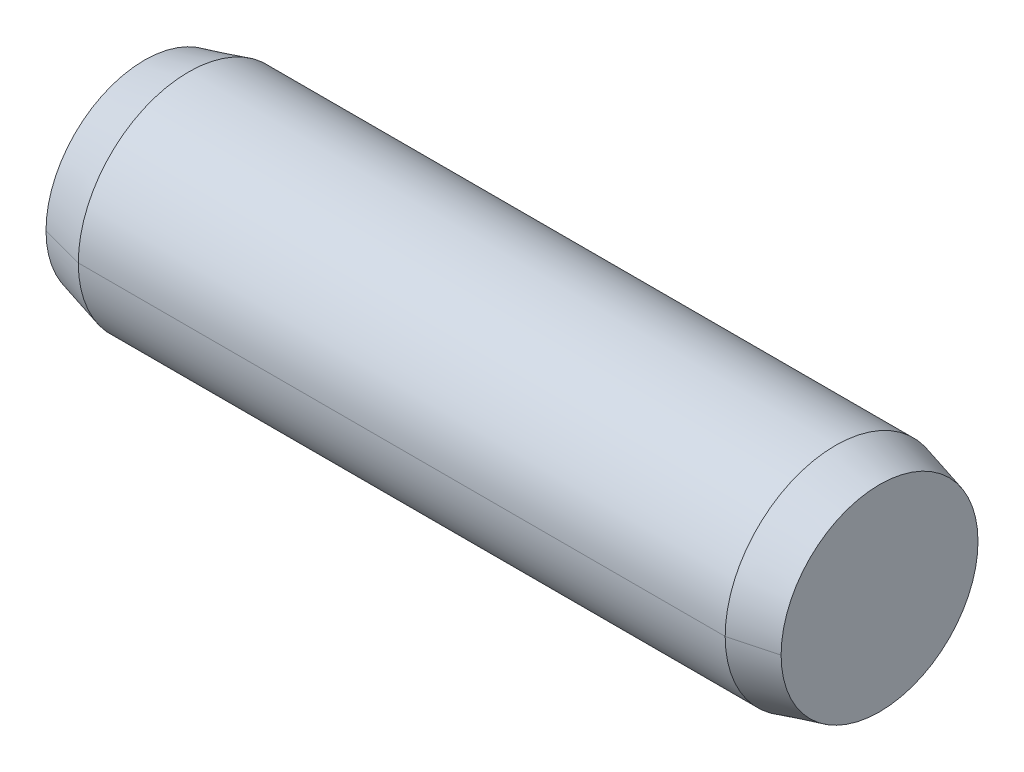
ISO-10303-21;
HEADER;
FILE_DESCRIPTION(('STEP AP214'),'2;1');
FILE_NAME('part.step','',(''),(''),'','','');
FILE_SCHEMA(('AUTOMOTIVE_DESIGN { 1 0 10303 214 1 1 1 1 }'));
ENDSEC;
DATA;
#1=APPLICATION_CONTEXT('core data for automotive mechanical design processes');
#2=APPLICATION_PROTOCOL_DEFINITION('international standard','automotive_design',2000,#1);
#3=PRODUCT_CONTEXT('',#1,'mechanical');
#4=PRODUCT('Part','Part','',(#3));
#5=PRODUCT_RELATED_PRODUCT_CATEGORY('part','',(#4));
#6=PRODUCT_DEFINITION_FORMATION('','',#4);
#7=PRODUCT_DEFINITION_CONTEXT('part definition',#1,'design');
#8=PRODUCT_DEFINITION('design','',#6,#7);
#9=PRODUCT_DEFINITION_SHAPE('','',#8);
#10=(LENGTH_UNIT() NAMED_UNIT(*) SI_UNIT(.MILLI.,.METRE.));
#11=(NAMED_UNIT(*) PLANE_ANGLE_UNIT() SI_UNIT($,.RADIAN.));
#12=(NAMED_UNIT(*) SI_UNIT($,.STERADIAN.) SOLID_ANGLE_UNIT());
#13=UNCERTAINTY_MEASURE_WITH_UNIT(LENGTH_MEASURE(1.E-05),#10,'distance_accuracy_value','');
#14=(GEOMETRIC_REPRESENTATION_CONTEXT(3) GLOBAL_UNCERTAINTY_ASSIGNED_CONTEXT((#13)) GLOBAL_UNIT_ASSIGNED_CONTEXT((#10,
#11,#12)) REPRESENTATION_CONTEXT('',''));
#15=CARTESIAN_POINT('',(0.,0.,0.));
#16=DIRECTION('',(0.,0.,1.));
#17=DIRECTION('',(1.,0.,0.));
#18=AXIS2_PLACEMENT_3D('',#15,#16,#17);
#19=CARTESIAN_POINT('',(3.,0.,0.));
#20=DIRECTION('',(1.,0.,0.));
#21=DIRECTION('',(0.,0.,-1.));
#22=AXIS2_PLACEMENT_3D('',#19,#20,#21);
#23=CONICAL_SURFACE('',#22,7.5,0.261799387799143);
#24=CARTESIAN_POINT('',(0.,0.,0.));
#25=DIRECTION('',(-1.,0.,0.));
#26=DIRECTION('',(0.,0.,1.));
#27=AXIS2_PLACEMENT_3D('',#24,#25,#26);
#28=CIRCLE('',#27,6.69615242270664);
#29=CARTESIAN_POINT('',(0.,0.,6.69615242270664));
#30=VERTEX_POINT('',#29);
#31=CARTESIAN_POINT('',(0.,0.,-6.69615242270664));
#32=VERTEX_POINT('',#31);
#33=EDGE_CURVE('E75',#30,#32,#28,.T.);
#34=ORIENTED_EDGE('',*,*,#33,.F.);
#35=DIRECTION('',(0.96592582628907,0.,0.258819045102515));
#36=VECTOR('',#35,1.);
#37=CARTESIAN_POINT('',(3.,0.,7.5));
#38=LINE('',#37,#36);
#39=CARTESIAN_POINT('',(3.,0.,7.5));
#40=VERTEX_POINT('',#39);
#41=EDGE_CURVE('E78',#30,#40,#38,.T.);
#42=ORIENTED_EDGE('',*,*,#41,.T.);
#43=CARTESIAN_POINT('',(3.,0.,0.));
#44=DIRECTION('',(-1.,0.,0.));
#45=DIRECTION('',(0.,0.,1.));
#46=AXIS2_PLACEMENT_3D('',#43,#44,#45);
#47=CIRCLE('',#46,7.5);
#48=CARTESIAN_POINT('',(3.,0.,-7.5));
#49=VERTEX_POINT('',#48);
#50=EDGE_CURVE('E11',#40,#49,#47,.T.);
#51=ORIENTED_EDGE('',*,*,#50,.T.);
#52=DIRECTION('',(0.96592582628907,0.,-0.258819045102515));
#53=VECTOR('',#52,1.);
#54=CARTESIAN_POINT('',(3.,0.,-7.5));
#55=LINE('',#54,#53);
#56=EDGE_CURVE('E80',#32,#49,#55,.T.);
#57=ORIENTED_EDGE('',*,*,#56,.F.);
#58=EDGE_LOOP('',(#34,#42,#51,#57));
#59=FACE_BOUND('',#58,.T.);
#60=ADVANCED_FACE('F17',(#59),#23,.T.);
#61=CARTESIAN_POINT('',(-6.35,0.,0.));
#62=DIRECTION('',(-1.,0.,0.));
#63=DIRECTION('',(0.,0.,1.));
#64=AXIS2_PLACEMENT_3D('',#61,#62,#63);
#65=CYLINDRICAL_SURFACE('',#64,7.5);
#66=CARTESIAN_POINT('',(47.,0.,0.));
#67=DIRECTION('',(-1.,0.,0.));
#68=DIRECTION('',(0.,0.,1.));
#69=AXIS2_PLACEMENT_3D('',#66,#67,#68);
#70=CIRCLE('',#69,7.5);
#71=CARTESIAN_POINT('',(47.,0.,7.5));
#72=VERTEX_POINT('',#71);
#73=CARTESIAN_POINT('',(47.,0.,-7.5));
#74=VERTEX_POINT('',#73);
#75=EDGE_CURVE('E27',#72,#74,#70,.T.);
#76=ORIENTED_EDGE('',*,*,#75,.T.);
#77=DIRECTION('',(-1.,0.,0.));
#78=VECTOR('',#77,1.);
#79=CARTESIAN_POINT('',(-6.35,0.,-7.5));
#80=LINE('',#79,#78);
#81=EDGE_CURVE('E110',#74,#49,#80,.T.);
#82=ORIENTED_EDGE('',*,*,#81,.T.);
#83=ORIENTED_EDGE('',*,*,#50,.F.);
#84=DIRECTION('',(-1.,0.,0.));
#85=VECTOR('',#84,1.);
#86=CARTESIAN_POINT('',(-6.35,0.,7.5));
#87=LINE('',#86,#85);
#88=EDGE_CURVE('E105',#72,#40,#87,.T.);
#89=ORIENTED_EDGE('',*,*,#88,.F.);
#90=EDGE_LOOP('',(#76,#82,#83,#89));
#91=FACE_BOUND('',#90,.T.);
#92=ADVANCED_FACE('F19',(#91),#65,.T.);
#93=CARTESIAN_POINT('',(50.,0.,0.));
#94=DIRECTION('',(-1.,0.,0.));
#95=DIRECTION('',(0.,0.,1.));
#96=AXIS2_PLACEMENT_3D('',#93,#94,#95);
#97=CONICAL_SURFACE('',#96,6.69615242270663,0.26179938779915);
#98=CARTESIAN_POINT('',(50.,0.,0.));
#99=DIRECTION('',(-1.,0.,0.));
#100=DIRECTION('',(0.,0.,1.));
#101=AXIS2_PLACEMENT_3D('',#98,#99,#100);
#102=CIRCLE('',#101,6.69615242270663);
#103=CARTESIAN_POINT('',(50.,0.,6.69615242270663));
#104=VERTEX_POINT('',#103);
#105=CARTESIAN_POINT('',(50.,0.,-6.69615242270663));
#106=VERTEX_POINT('',#105);
#107=EDGE_CURVE('E40',#104,#106,#102,.T.);
#108=ORIENTED_EDGE('',*,*,#107,.T.);
#109=DIRECTION('',(-0.965925826289068,0.,-0.258819045102521));
#110=VECTOR('',#109,1.);
#111=CARTESIAN_POINT('',(50.,0.,-6.69615242270663));
#112=LINE('',#111,#110);
#113=EDGE_CURVE('E101',#106,#74,#112,.T.);
#114=ORIENTED_EDGE('',*,*,#113,.T.);
#115=ORIENTED_EDGE('',*,*,#75,.F.);
#116=DIRECTION('',(-0.965925826289068,0.,0.258819045102521));
#117=VECTOR('',#116,1.);
#118=CARTESIAN_POINT('',(50.,0.,6.69615242270663));
#119=LINE('',#118,#117);
#120=EDGE_CURVE('E21',#104,#72,#119,.T.);
#121=ORIENTED_EDGE('',*,*,#120,.F.);
#122=EDGE_LOOP('',(#108,#114,#115,#121));
#123=FACE_BOUND('',#122,.T.);
#124=ADVANCED_FACE('F154',(#123),#97,.T.);
#125=CARTESIAN_POINT('',(0.,6.69615242270664,0.));
#126=DIRECTION('',(1.,0.,0.));
#127=DIRECTION('',(0.,1.,0.));
#128=AXIS2_PLACEMENT_3D('',#125,#126,#127);
#129=PLANE('',#128);
#130=CARTESIAN_POINT('',(0.,0.,0.));
#131=DIRECTION('',(-1.,0.,0.));
#132=DIRECTION('',(0.,0.,1.));
#133=AXIS2_PLACEMENT_3D('',#130,#131,#132);
#134=CIRCLE('',#133,6.69615242270664);
#135=EDGE_CURVE('E85',#32,#30,#134,.T.);
#136=ORIENTED_EDGE('',*,*,#135,.T.);
#137=ORIENTED_EDGE('',*,*,#33,.T.);
#138=EDGE_LOOP('',(#136,#137));
#139=FACE_BOUND('',#138,.T.);
#140=ADVANCED_FACE('F86',(#139),#129,.F.);
#141=CARTESIAN_POINT('',(50.,0.,0.));
#142=DIRECTION('',(-1.,0.,0.));
#143=DIRECTION('',(0.,0.,1.));
#144=AXIS2_PLACEMENT_3D('',#141,#142,#143);
#145=PLANE('',#144);
#146=ORIENTED_EDGE('',*,*,#107,.F.);
#147=CARTESIAN_POINT('',(50.,0.,0.));
#148=DIRECTION('',(-1.,0.,0.));
#149=DIRECTION('',(0.,0.,1.));
#150=AXIS2_PLACEMENT_3D('',#147,#148,#149);
#151=CIRCLE('',#150,6.69615242270663);
#152=EDGE_CURVE('E104',#106,#104,#151,.T.);
#153=ORIENTED_EDGE('',*,*,#152,.F.);
#154=EDGE_LOOP('',(#146,#153));
#155=FACE_BOUND('',#154,.T.);
#156=ADVANCED_FACE('F147',(#155),#145,.F.);
#157=CARTESIAN_POINT('',(50.,0.,0.));
#158=DIRECTION('',(-1.,0.,0.));
#159=DIRECTION('',(0.,0.,1.));
#160=AXIS2_PLACEMENT_3D('',#157,#158,#159);
#161=CONICAL_SURFACE('',#160,6.69615242270663,0.26179938779915);
#162=ORIENTED_EDGE('',*,*,#113,.F.);
#163=ORIENTED_EDGE('',*,*,#152,.T.);
#164=ORIENTED_EDGE('',*,*,#120,.T.);
#165=CARTESIAN_POINT('',(47.,0.,0.));
#166=DIRECTION('',(-1.,0.,0.));
#167=DIRECTION('',(0.,0.,1.));
#168=AXIS2_PLACEMENT_3D('',#165,#166,#167);
#169=CIRCLE('',#168,7.5);
#170=EDGE_CURVE('E114',#74,#72,#169,.T.);
#171=ORIENTED_EDGE('',*,*,#170,.F.);
#172=EDGE_LOOP('',(#162,#163,#164,#171));
#173=FACE_BOUND('',#172,.T.);
#174=ADVANCED_FACE('F134',(#173),#161,.T.);
#175=CARTESIAN_POINT('',(-6.35,0.,0.));
#176=DIRECTION('',(-1.,0.,0.));
#177=DIRECTION('',(0.,0.,1.));
#178=AXIS2_PLACEMENT_3D('',#175,#176,#177);
#179=CYLINDRICAL_SURFACE('',#178,7.5);
#180=ORIENTED_EDGE('',*,*,#81,.F.);
#181=ORIENTED_EDGE('',*,*,#170,.T.);
#182=ORIENTED_EDGE('',*,*,#88,.T.);
#183=CARTESIAN_POINT('',(3.,0.,0.));
#184=DIRECTION('',(-1.,0.,0.));
#185=DIRECTION('',(0.,0.,1.));
#186=AXIS2_PLACEMENT_3D('',#183,#184,#185);
#187=CIRCLE('',#186,7.5);
#188=EDGE_CURVE('E93',#49,#40,#187,.T.);
#189=ORIENTED_EDGE('',*,*,#188,.F.);
#190=EDGE_LOOP('',(#180,#181,#182,#189));
#191=FACE_BOUND('',#190,.T.);
#192=ADVANCED_FACE('F138',(#191),#179,.T.);
#193=CARTESIAN_POINT('',(3.,0.,0.));
#194=DIRECTION('',(1.,0.,0.));
#195=DIRECTION('',(0.,0.,-1.));
#196=AXIS2_PLACEMENT_3D('',#193,#194,#195);
#197=CONICAL_SURFACE('',#196,7.5,0.261799387799143);
#198=ORIENTED_EDGE('',*,*,#41,.F.);
#199=ORIENTED_EDGE('',*,*,#135,.F.);
#200=ORIENTED_EDGE('',*,*,#56,.T.);
#201=ORIENTED_EDGE('',*,*,#188,.T.);
#202=EDGE_LOOP('',(#198,#199,#200,#201));
#203=FACE_BOUND('',#202,.T.);
#204=ADVANCED_FACE('F91',(#203),#197,.T.);
#205=CLOSED_SHELL('',(#60,#92,#124,#140,#156,#174,#192,#204));
#206=MANIFOLD_SOLID_BREP('B1',#205);
#207=ADVANCED_BREP_SHAPE_REPRESENTATION('',(#18,#206),#14);
#208=SHAPE_DEFINITION_REPRESENTATION(#9,#207);
ENDSEC;
END-ISO-10303-21;
